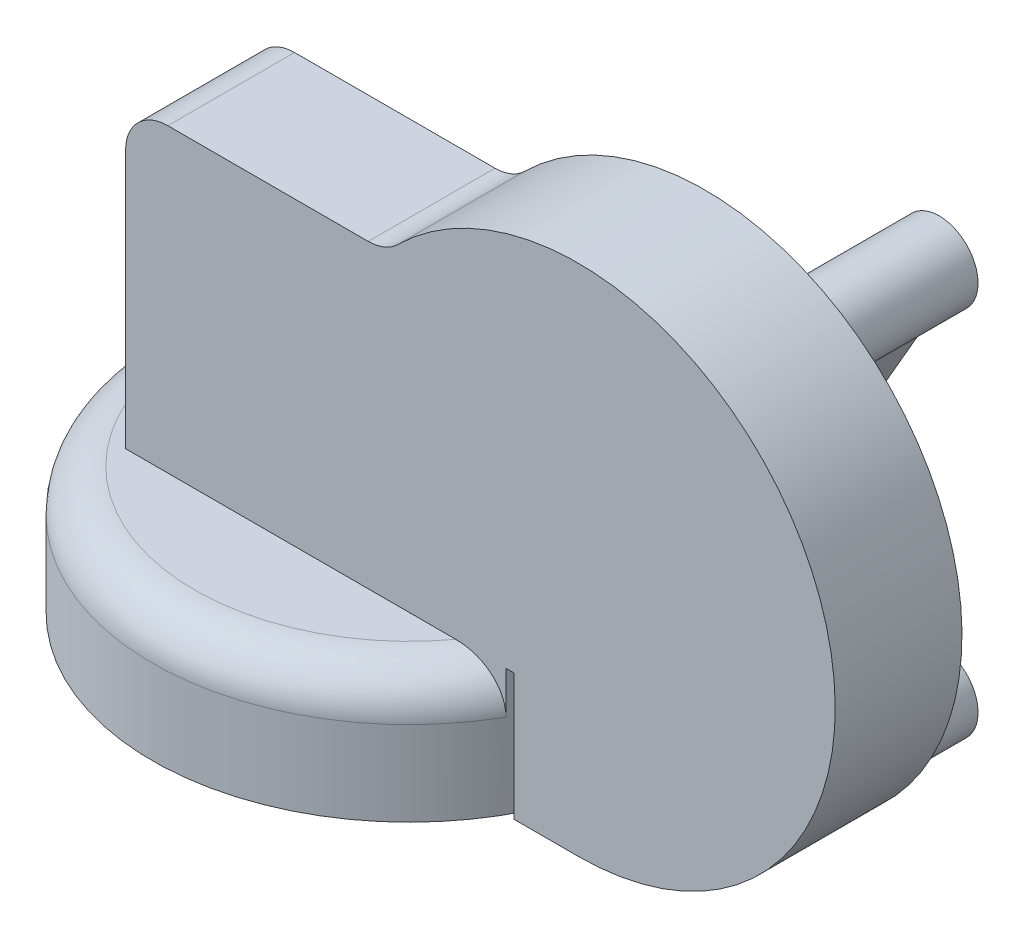
ISO-10303-21;
HEADER;
FILE_DESCRIPTION(('STEP AP214'),'2;1');
FILE_NAME('part.step','',(''),(''),'','','');
FILE_SCHEMA(('AUTOMOTIVE_DESIGN { 1 0 10303 214 1 1 1 1 }'));
ENDSEC;
DATA;
#1=APPLICATION_CONTEXT('core data for automotive mechanical design processes');
#2=APPLICATION_PROTOCOL_DEFINITION('international standard','automotive_design',2000,#1);
#3=PRODUCT_CONTEXT('',#1,'mechanical');
#4=PRODUCT('Part','Part','',(#3));
#5=PRODUCT_RELATED_PRODUCT_CATEGORY('part','',(#4));
#6=PRODUCT_DEFINITION_FORMATION('','',#4);
#7=PRODUCT_DEFINITION_CONTEXT('part definition',#1,'design');
#8=PRODUCT_DEFINITION('design','',#6,#7);
#9=PRODUCT_DEFINITION_SHAPE('','',#8);
#10=(LENGTH_UNIT() NAMED_UNIT(*) SI_UNIT(.MILLI.,.METRE.));
#11=(NAMED_UNIT(*) PLANE_ANGLE_UNIT() SI_UNIT($,.RADIAN.));
#12=(NAMED_UNIT(*) SI_UNIT($,.STERADIAN.) SOLID_ANGLE_UNIT());
#13=UNCERTAINTY_MEASURE_WITH_UNIT(LENGTH_MEASURE(1.E-05),#10,'distance_accuracy_value','');
#14=(GEOMETRIC_REPRESENTATION_CONTEXT(3) GLOBAL_UNCERTAINTY_ASSIGNED_CONTEXT((#13)) GLOBAL_UNIT_ASSIGNED_CONTEXT((#10,
#11,#12)) REPRESENTATION_CONTEXT('',''));
#15=CARTESIAN_POINT('',(0.,0.,0.));
#16=DIRECTION('',(0.,0.,1.));
#17=DIRECTION('',(1.,0.,0.));
#18=AXIS2_PLACEMENT_3D('',#15,#16,#17);
#19=CARTESIAN_POINT('',(35.,30.4,0.));
#20=DIRECTION('',(0.,0.,1.));
#21=DIRECTION('',(1.,0.,0.));
#22=AXIS2_PLACEMENT_3D('',#19,#20,#21);
#23=PLANE('',#22);
#24=DIRECTION('',(0.,-1.,0.));
#25=VECTOR('',#24,1.);
#26=CARTESIAN_POINT('',(-18.5758086309329,50.6001142080126,0.));
#27=LINE('',#26,#25);
#28=CARTESIAN_POINT('',(-18.5758086309329,45.6001142080127,0.));
#29=VERTEX_POINT('',#28);
#30=CARTESIAN_POINT('',(-18.5758086309329,15.,0.));
#31=VERTEX_POINT('',#30);
#32=EDGE_CURVE('E241',#29,#31,#27,.T.);
#33=ORIENTED_EDGE('',*,*,#32,.F.);
#34=CARTESIAN_POINT('',(-13.5758086309329,45.6001142080127,0.));
#35=DIRECTION('',(0.,0.,1.));
#36=DIRECTION('',(1.,0.,0.));
#37=AXIS2_PLACEMENT_3D('',#34,#35,#36);
#38=CIRCLE('',#37,5.);
#39=CARTESIAN_POINT('',(-13.5758086309329,50.6001142080126,0.));
#40=VERTEX_POINT('',#39);
#41=EDGE_CURVE('E269',#29,#40,#38,.F.);
#42=ORIENTED_EDGE('',*,*,#41,.T.);
#43=DIRECTION('',(-1.,0.,0.));
#44=VECTOR('',#43,1.);
#45=CARTESIAN_POINT('',(12.2818269664296,50.6001142080126,0.));
#46=LINE('',#45,#44);
#47=CARTESIAN_POINT('',(10.1380965349972,50.6001142080126,0.));
#48=VERTEX_POINT('',#47);
#49=EDGE_CURVE('E238',#48,#40,#46,.T.);
#50=ORIENTED_EDGE('',*,*,#49,.F.);
#51=CARTESIAN_POINT('',(10.1380965349972,55.6001142080126,0.));
#52=DIRECTION('',(0.,0.,1.));
#53=DIRECTION('',(1.,0.,0.));
#54=AXIS2_PLACEMENT_3D('',#51,#52,#53);
#55=CIRCLE('',#54,5.);
#56=CARTESIAN_POINT('',(13.6496648210145,52.0407760430391,0.));
#57=VERTEX_POINT('',#56);
#58=EDGE_CURVE('E288',#48,#57,#55,.T.);
#59=ORIENTED_EDGE('',*,*,#58,.T.);
#60=CARTESIAN_POINT('',(35.,30.4,0.));
#61=DIRECTION('',(0.,0.,1.));
#62=DIRECTION('',(1.,0.,0.));
#63=AXIS2_PLACEMENT_3D('',#60,#61,#62);
#64=CIRCLE('',#63,30.4);
#65=CARTESIAN_POINT('',(35.,0.,0.));
#66=VERTEX_POINT('',#65);
#67=EDGE_CURVE('E211',#66,#57,#64,.T.);
#68=ORIENTED_EDGE('',*,*,#67,.F.);
#69=DIRECTION('',(1.,0.,0.));
#70=VECTOR('',#69,1.);
#71=CARTESIAN_POINT('',(27.3860251075192,0.,0.));
#72=LINE('',#71,#70);
#73=CARTESIAN_POINT('',(30.4,0.,0.));
#74=VERTEX_POINT('',#73);
#75=EDGE_CURVE('E209',#74,#66,#72,.T.);
#76=ORIENTED_EDGE('',*,*,#75,.F.);
#77=DIRECTION('',(0.,-1.,0.));
#78=VECTOR('',#77,1.);
#79=CARTESIAN_POINT('',(30.4,15.,0.));
#80=LINE('',#79,#78);
#81=CARTESIAN_POINT('',(30.4,10.,0.));
#82=VERTEX_POINT('',#81);
#83=EDGE_CURVE('E256',#74,#82,#80,.F.);
#84=ORIENTED_EDGE('',*,*,#83,.T.);
#85=CARTESIAN_POINT('',(25.4,10.,0.));
#86=DIRECTION('',(0.,0.,1.));
#87=DIRECTION('',(1.,0.,0.));
#88=AXIS2_PLACEMENT_3D('',#85,#86,#87);
#89=CIRCLE('',#88,5.);
#90=CARTESIAN_POINT('',(25.4,15.,0.));
#91=VERTEX_POINT('',#90);
#92=EDGE_CURVE('E11',#82,#91,#89,.T.);
#93=ORIENTED_EDGE('',*,*,#92,.T.);
#94=DIRECTION('',(1.,0.,0.));
#95=VECTOR('',#94,1.);
#96=CARTESIAN_POINT('',(-18.5758086309329,15.,0.));
#97=LINE('',#96,#95);
#98=EDGE_CURVE('E221',#31,#91,#97,.T.);
#99=ORIENTED_EDGE('',*,*,#98,.F.);
#100=EDGE_LOOP('',(#33,#42,#50,#59,#68,#76,#84,#93,#99));
#101=FACE_BOUND('',#100,.T.);
#102=CARTESIAN_POINT('',(47.7000000000001,52.3970452561247,0.));
#103=DIRECTION('',(0.,0.,-1.));
#104=DIRECTION('',(-1.,0.,0.));
#105=AXIS2_PLACEMENT_3D('',#102,#103,#104);
#106=CIRCLE('',#105,4.6);
#107=CARTESIAN_POINT('',(43.7162831425917,50.0970452561247,0.));
#108=VERTEX_POINT('',#107);
#109=CARTESIAN_POINT('',(47.7000000000001,47.7970452561247,0.));
#110=VERTEX_POINT('',#109);
#111=EDGE_CURVE('E208',#108,#110,#106,.T.);
#112=ORIENTED_EDGE('',*,*,#111,.F.);
#113=DIRECTION('',(0.500000000000004,0.866025403784436,0.));
#114=VECTOR('',#113,1.);
#115=CARTESIAN_POINT('',(43.7162831425917,50.0970452561247,0.));
#116=LINE('',#115,#114);
#117=CARTESIAN_POINT('',(35.,35.,0.));
#118=VERTEX_POINT('',#117);
#119=EDGE_CURVE('E205',#118,#108,#116,.T.);
#120=ORIENTED_EDGE('',*,*,#119,.F.);
#121=CARTESIAN_POINT('',(35.,30.4,0.));
#122=DIRECTION('',(0.,0.,-1.));
#123=DIRECTION('',(-1.,0.,0.));
#124=AXIS2_PLACEMENT_3D('',#121,#122,#123);
#125=CIRCLE('',#124,4.6);
#126=CARTESIAN_POINT('',(31.0162831425916,32.7,0.));
#127=VERTEX_POINT('',#126);
#128=EDGE_CURVE('E383',#127,#118,#125,.T.);
#129=ORIENTED_EDGE('',*,*,#128,.F.);
#130=DIRECTION('',(1.,0.,0.));
#131=VECTOR('',#130,1.);
#132=CARTESIAN_POINT('',(13.5837168574084,32.7,0.));
#133=LINE('',#132,#131);
#134=CARTESIAN_POINT('',(13.5837168574084,32.7,0.));
#135=VERTEX_POINT('',#134);
#136=EDGE_CURVE('E441',#135,#127,#133,.T.);
#137=ORIENTED_EDGE('',*,*,#136,.F.);
#138=CARTESIAN_POINT('',(9.6,30.4,0.));
#139=DIRECTION('',(0.,0.,-1.));
#140=DIRECTION('',(-1.,0.,0.));
#141=AXIS2_PLACEMENT_3D('',#138,#139,#140);
#142=CIRCLE('',#141,4.60000000000001);
#143=CARTESIAN_POINT('',(13.5837168574084,28.1,0.));
#144=VERTEX_POINT('',#143);
#145=EDGE_CURVE('E438',#144,#135,#142,.T.);
#146=ORIENTED_EDGE('',*,*,#145,.F.);
#147=DIRECTION('',(-1.,0.,0.));
#148=VECTOR('',#147,1.);
#149=CARTESIAN_POINT('',(31.0162831425916,28.1,0.));
#150=LINE('',#149,#148);
#151=CARTESIAN_POINT('',(31.0162831425916,28.1,0.));
#152=VERTEX_POINT('',#151);
#153=EDGE_CURVE('E435',#152,#144,#150,.T.);
#154=ORIENTED_EDGE('',*,*,#153,.F.);
#155=CARTESIAN_POINT('',(35.,30.4,0.));
#156=DIRECTION('',(0.,0.,-1.));
#157=DIRECTION('',(-1.,0.,0.));
#158=AXIS2_PLACEMENT_3D('',#155,#156,#157);
#159=CIRCLE('',#158,4.6);
#160=CARTESIAN_POINT('',(35.,25.8,0.));
#161=VERTEX_POINT('',#160);
#162=EDGE_CURVE('E432',#161,#152,#159,.T.);
#163=ORIENTED_EDGE('',*,*,#162,.F.);
#164=DIRECTION('',(-0.499999999999991,0.866025403784444,0.));
#165=VECTOR('',#164,1.);
#166=CARTESIAN_POINT('',(35.,25.8,0.));
#167=LINE('',#166,#165);
#168=CARTESIAN_POINT('',(43.7162831425914,10.7029547438752,0.));
#169=VERTEX_POINT('',#168);
#170=EDGE_CURVE('E429',#169,#161,#167,.T.);
#171=ORIENTED_EDGE('',*,*,#170,.F.);
#172=CARTESIAN_POINT('',(47.6999999999998,8.40295474387513,0.));
#173=DIRECTION('',(0.,0.,-1.));
#174=DIRECTION('',(-1.,0.,0.));
#175=AXIS2_PLACEMENT_3D('',#172,#173,#174);
#176=CIRCLE('',#175,4.60000000000001);
#177=CARTESIAN_POINT('',(47.6999999999998,13.0029547438751,0.));
#178=VERTEX_POINT('',#177);
#179=EDGE_CURVE('E423',#178,#169,#176,.T.);
#180=ORIENTED_EDGE('',*,*,#179,.F.);
#181=DIRECTION('',(0.499999999999991,-0.866025403784444,0.));
#182=VECTOR('',#181,1.);
#183=CARTESIAN_POINT('',(38.9837168574084,28.0999999999999,0.));
#184=LINE('',#183,#182);
#185=CARTESIAN_POINT('',(38.9837168574084,28.0999999999999,0.));
#186=VERTEX_POINT('',#185);
#187=EDGE_CURVE('E418',#186,#178,#184,.T.);
#188=ORIENTED_EDGE('',*,*,#187,.F.);
#189=CARTESIAN_POINT('',(35.,30.4,0.));
#190=DIRECTION('',(0.,0.,-1.));
#191=DIRECTION('',(-1.,0.,0.));
#192=AXIS2_PLACEMENT_3D('',#189,#190,#191);
#193=CIRCLE('',#192,4.60000000000001);
#194=CARTESIAN_POINT('',(38.9837168574085,32.7,0.));
#195=VERTEX_POINT('',#194);
#196=EDGE_CURVE('E54',#195,#186,#193,.T.);
#197=ORIENTED_EDGE('',*,*,#196,.F.);
#198=DIRECTION('',(-0.500000000000004,-0.866025403784436,0.));
#199=VECTOR('',#198,1.);
#200=CARTESIAN_POINT('',(47.7000000000001,47.7970452561247,0.));
#201=LINE('',#200,#199);
#202=EDGE_CURVE('E49',#110,#195,#201,.T.);
#203=ORIENTED_EDGE('',*,*,#202,.F.);
#204=EDGE_LOOP('',(#112,#120,#129,#137,#146,#154,#163,#171,#180,#188,#197,#203));
#205=FACE_BOUND('',#204,.T.);
#206=ADVANCED_FACE('F33',(#101,#205),#23,.F.);
#207=CARTESIAN_POINT('',(0.,15.,0.));
#208=DIRECTION('',(0.,-1.,0.));
#209=DIRECTION('',(0.,0.,-1.));
#210=AXIS2_PLACEMENT_3D('',#207,#208,#209);
#211=CYLINDRICAL_SURFACE('',#210,30.4);
#212=CARTESIAN_POINT('',(0.,15.,0.));
#213=DIRECTION('',(0.,1.,0.));
#214=DIRECTION('',(0.,0.,1.));
#215=AXIS2_PLACEMENT_3D('',#212,#213,#214);
#216=CIRCLE('',#215,30.4);
#217=CARTESIAN_POINT('',(26.4416338375676,15.,15.));
#218=VERTEX_POINT('',#217);
#219=CARTESIAN_POINT('',(27.3860251075192,15.,13.1971826088119));
#220=VERTEX_POINT('',#219);
#221=EDGE_CURVE('E262',#218,#220,#216,.T.);
#222=ORIENTED_EDGE('',*,*,#221,.F.);
#223=DIRECTION('',(0.,-1.,0.));
#224=VECTOR('',#223,1.);
#225=CARTESIAN_POINT('',(26.4416338375676,15.,15.));
#226=LINE('',#225,#224);
#227=CARTESIAN_POINT('',(26.4416338375676,10.,15.));
#228=VERTEX_POINT('',#227);
#229=EDGE_CURVE('E285',#218,#228,#226,.T.);
#230=ORIENTED_EDGE('',*,*,#229,.T.);
#231=CARTESIAN_POINT('',(0.,10.,0.));
#232=DIRECTION('',(0.,1.,0.));
#233=DIRECTION('',(0.,0.,1.));
#234=AXIS2_PLACEMENT_3D('',#231,#232,#233);
#235=CIRCLE('',#234,30.4);
#236=EDGE_CURVE('E283',#228,#82,#235,.F.);
#237=ORIENTED_EDGE('',*,*,#236,.T.);
#238=ORIENTED_EDGE('',*,*,#83,.F.);
#239=CARTESIAN_POINT('',(0.,0.,0.));
#240=DIRECTION('',(0.,1.,0.));
#241=DIRECTION('',(0.,0.,1.));
#242=AXIS2_PLACEMENT_3D('',#239,#240,#241);
#243=CIRCLE('',#242,30.4);
#244=CARTESIAN_POINT('',(27.3860251075192,0.,13.1971826088119));
#245=VERTEX_POINT('',#244);
#246=EDGE_CURVE('E261',#74,#245,#243,.T.);
#247=ORIENTED_EDGE('',*,*,#246,.T.);
#248=DIRECTION('',(0.,-1.,0.));
#249=VECTOR('',#248,1.);
#250=CARTESIAN_POINT('',(27.3860251075192,15.,13.1971826088119));
#251=LINE('',#250,#249);
#252=EDGE_CURVE('E259',#220,#245,#251,.T.);
#253=ORIENTED_EDGE('',*,*,#252,.F.);
#254=EDGE_LOOP('',(#222,#230,#237,#238,#247,#253));
#255=FACE_BOUND('',#254,.T.);
#256=ADVANCED_FACE('F306',(#255),#211,.T.);
#257=CARTESIAN_POINT('',(0.,15.,0.));
#258=DIRECTION('',(0.,1.,0.));
#259=DIRECTION('',(0.,0.,1.));
#260=AXIS2_PLACEMENT_3D('',#257,#258,#259);
#261=PLANE('',#260);
#262=ORIENTED_EDGE('',*,*,#98,.T.);
#263=CARTESIAN_POINT('',(0.,15.,0.));
#264=DIRECTION('',(0.,1.,0.));
#265=DIRECTION('',(0.,0.,1.));
#266=AXIS2_PLACEMENT_3D('',#263,#264,#265);
#267=CIRCLE('',#266,25.4);
#268=CARTESIAN_POINT('',(20.4978047605103,15.,15.));
#269=VERTEX_POINT('',#268);
#270=EDGE_CURVE('E280',#91,#269,#267,.T.);
#271=ORIENTED_EDGE('',*,*,#270,.T.);
#272=DIRECTION('',(1.,0.,0.));
#273=VECTOR('',#272,1.);
#274=CARTESIAN_POINT('',(-18.5758086309329,15.,15.));
#275=LINE('',#274,#273);
#276=CARTESIAN_POINT('',(-18.5758086309329,15.,15.));
#277=VERTEX_POINT('',#276);
#278=EDGE_CURVE('E232',#277,#269,#275,.T.);
#279=ORIENTED_EDGE('',*,*,#278,.F.);
#280=DIRECTION('',(0.,0.,-1.));
#281=VECTOR('',#280,1.);
#282=CARTESIAN_POINT('',(-18.5758086309329,15.,15.));
#283=LINE('',#282,#281);
#284=EDGE_CURVE('E247',#277,#31,#283,.T.);
#285=ORIENTED_EDGE('',*,*,#284,.T.);
#286=EDGE_LOOP('',(#262,#271,#279,#285));
#287=FACE_BOUND('',#286,.T.);
#288=ADVANCED_FACE('F328',(#287),#261,.T.);
#289=CARTESIAN_POINT('',(0.,0.,0.));
#290=DIRECTION('',(0.,1.,0.));
#291=DIRECTION('',(0.,0.,1.));
#292=AXIS2_PLACEMENT_3D('',#289,#290,#291);
#293=PLANE('',#292);
#294=ORIENTED_EDGE('',*,*,#246,.F.);
#295=ORIENTED_EDGE('',*,*,#75,.T.);
#296=DIRECTION('',(0.,0.,-1.));
#297=VECTOR('',#296,1.);
#298=CARTESIAN_POINT('',(35.,0.,15.));
#299=LINE('',#298,#297);
#300=CARTESIAN_POINT('',(35.,0.,15.));
#301=VERTEX_POINT('',#300);
#302=EDGE_CURVE('E250',#301,#66,#299,.T.);
#303=ORIENTED_EDGE('',*,*,#302,.F.);
#304=DIRECTION('',(1.,0.,0.));
#305=VECTOR('',#304,1.);
#306=CARTESIAN_POINT('',(27.3860251075192,0.,15.));
#307=LINE('',#306,#305);
#308=CARTESIAN_POINT('',(27.3860251075192,0.,15.));
#309=VERTEX_POINT('',#308);
#310=EDGE_CURVE('E220',#309,#301,#307,.T.);
#311=ORIENTED_EDGE('',*,*,#310,.F.);
#312=DIRECTION('',(0.,0.,-1.));
#313=VECTOR('',#312,1.);
#314=CARTESIAN_POINT('',(27.3860251075192,0.,15.));
#315=LINE('',#314,#313);
#316=EDGE_CURVE('E253',#309,#245,#315,.T.);
#317=ORIENTED_EDGE('',*,*,#316,.T.);
#318=EDGE_LOOP('',(#294,#295,#303,#311,#317));
#319=FACE_BOUND('',#318,.T.);
#320=ADVANCED_FACE('F312',(#319),#293,.F.);
#321=CARTESIAN_POINT('',(-18.5758086309329,15.,15.));
#322=DIRECTION('',(0.,1.,0.));
#323=DIRECTION('',(0.,0.,1.));
#324=AXIS2_PLACEMENT_3D('',#321,#322,#323);
#325=PLANE('',#324);
#326=CARTESIAN_POINT('',(27.3860251075192,15.,15.));
#327=VERTEX_POINT('',#326);
#328=EDGE_CURVE('E231',#218,#327,#275,.T.);
#329=ORIENTED_EDGE('',*,*,#328,.F.);
#330=ORIENTED_EDGE('',*,*,#221,.T.);
#331=DIRECTION('',(0.,0.,-1.));
#332=VECTOR('',#331,1.);
#333=CARTESIAN_POINT('',(27.3860251075192,15.,15.));
#334=LINE('',#333,#332);
#335=EDGE_CURVE('E234',#327,#220,#334,.T.);
#336=ORIENTED_EDGE('',*,*,#335,.F.);
#337=EDGE_LOOP('',(#329,#330,#336));
#338=FACE_BOUND('',#337,.T.);
#339=ADVANCED_FACE('F308',(#338),#325,.F.);
#340=CARTESIAN_POINT('',(27.3860251075192,15.,15.));
#341=DIRECTION('',(1.,0.,0.));
#342=DIRECTION('',(0.,0.,-1.));
#343=AXIS2_PLACEMENT_3D('',#340,#341,#342);
#344=PLANE('',#343);
#345=ORIENTED_EDGE('',*,*,#335,.T.);
#346=ORIENTED_EDGE('',*,*,#252,.T.);
#347=ORIENTED_EDGE('',*,*,#316,.F.);
#348=DIRECTION('',(0.,-1.,0.));
#349=VECTOR('',#348,1.);
#350=CARTESIAN_POINT('',(27.3860251075192,15.,15.));
#351=LINE('',#350,#349);
#352=EDGE_CURVE('E217',#327,#309,#351,.T.);
#353=ORIENTED_EDGE('',*,*,#352,.F.);
#354=EDGE_LOOP('',(#345,#346,#347,#353));
#355=FACE_BOUND('',#354,.T.);
#356=ADVANCED_FACE('F311',(#355),#344,.F.);
#357=CARTESIAN_POINT('',(35.,30.4,15.));
#358=DIRECTION('',(0.,0.,-1.));
#359=DIRECTION('',(-1.,0.,0.));
#360=AXIS2_PLACEMENT_3D('',#357,#358,#359);
#361=CYLINDRICAL_SURFACE('',#360,30.4);
#362=ORIENTED_EDGE('',*,*,#67,.T.);
#363=DIRECTION('',(0.,0.,-1.));
#364=VECTOR('',#363,1.);
#365=CARTESIAN_POINT('',(13.6496648210145,52.0407760430391,15.));
#366=LINE('',#365,#364);
#367=CARTESIAN_POINT('',(13.6496648210145,52.0407760430391,15.));
#368=VERTEX_POINT('',#367);
#369=EDGE_CURVE('E278',#57,#368,#366,.F.);
#370=ORIENTED_EDGE('',*,*,#369,.T.);
#371=CARTESIAN_POINT('',(35.,30.4,15.));
#372=DIRECTION('',(0.,0.,1.));
#373=DIRECTION('',(1.,0.,0.));
#374=AXIS2_PLACEMENT_3D('',#371,#372,#373);
#375=CIRCLE('',#374,30.4);
#376=EDGE_CURVE('E223',#301,#368,#375,.T.);
#377=ORIENTED_EDGE('',*,*,#376,.F.);
#378=ORIENTED_EDGE('',*,*,#302,.T.);
#379=EDGE_LOOP('',(#362,#370,#377,#378));
#380=FACE_BOUND('',#379,.T.);
#381=ADVANCED_FACE('F320',(#380),#361,.T.);
#382=CARTESIAN_POINT('',(12.2818269664296,50.6001142080126,15.));
#383=DIRECTION('',(0.,-1.,0.));
#384=DIRECTION('',(0.,0.,-1.));
#385=AXIS2_PLACEMENT_3D('',#382,#383,#384);
#386=PLANE('',#385);
#387=ORIENTED_EDGE('',*,*,#49,.T.);
#388=DIRECTION('',(0.,0.,-1.));
#389=VECTOR('',#388,1.);
#390=CARTESIAN_POINT('',(-13.5758086309329,50.6001142080126,15.));
#391=LINE('',#390,#389);
#392=CARTESIAN_POINT('',(-13.5758086309329,50.6001142080126,15.));
#393=VERTEX_POINT('',#392);
#394=EDGE_CURVE('E274',#40,#393,#391,.F.);
#395=ORIENTED_EDGE('',*,*,#394,.T.);
#396=DIRECTION('',(-1.,0.,0.));
#397=VECTOR('',#396,1.);
#398=CARTESIAN_POINT('',(12.2818269664296,50.6001142080126,15.));
#399=LINE('',#398,#397);
#400=CARTESIAN_POINT('',(10.1380965349972,50.6001142080126,15.));
#401=VERTEX_POINT('',#400);
#402=EDGE_CURVE('E226',#401,#393,#399,.T.);
#403=ORIENTED_EDGE('',*,*,#402,.F.);
#404=DIRECTION('',(0.,0.,1.));
#405=VECTOR('',#404,1.);
#406=CARTESIAN_POINT('',(10.1380965349972,50.6001142080126,0.));
#407=LINE('',#406,#405);
#408=EDGE_CURVE('E271',#401,#48,#407,.F.);
#409=ORIENTED_EDGE('',*,*,#408,.T.);
#410=EDGE_LOOP('',(#387,#395,#403,#409));
#411=FACE_BOUND('',#410,.T.);
#412=ADVANCED_FACE('F316',(#411),#386,.F.);
#413=CARTESIAN_POINT('',(-18.5758086309329,50.6001142080126,15.));
#414=DIRECTION('',(1.,0.,0.));
#415=DIRECTION('',(0.,0.,-1.));
#416=AXIS2_PLACEMENT_3D('',#413,#414,#415);
#417=PLANE('',#416);
#418=DIRECTION('',(0.,-1.,0.));
#419=VECTOR('',#418,1.);
#420=CARTESIAN_POINT('',(-18.5758086309329,50.6001142080126,15.));
#421=LINE('',#420,#419);
#422=CARTESIAN_POINT('',(-18.5758086309329,45.6001142080127,15.));
#423=VERTEX_POINT('',#422);
#424=EDGE_CURVE('E229',#423,#277,#421,.T.);
#425=ORIENTED_EDGE('',*,*,#424,.F.);
#426=DIRECTION('',(0.,0.,-1.));
#427=VECTOR('',#426,1.);
#428=CARTESIAN_POINT('',(-18.5758086309329,45.6001142080127,15.));
#429=LINE('',#428,#427);
#430=EDGE_CURVE('E264',#423,#29,#429,.T.);
#431=ORIENTED_EDGE('',*,*,#430,.T.);
#432=ORIENTED_EDGE('',*,*,#32,.T.);
#433=ORIENTED_EDGE('',*,*,#284,.F.);
#434=EDGE_LOOP('',(#425,#431,#432,#433));
#435=FACE_BOUND('',#434,.T.);
#436=ADVANCED_FACE('F301',(#435),#417,.F.);
#437=CARTESIAN_POINT('',(35.,30.4,15.));
#438=DIRECTION('',(0.,0.,1.));
#439=DIRECTION('',(1.,0.,0.));
#440=AXIS2_PLACEMENT_3D('',#437,#438,#439);
#441=PLANE('',#440);
#442=ORIENTED_EDGE('',*,*,#402,.T.);
#443=CARTESIAN_POINT('',(-13.5758086309329,45.6001142080127,15.));
#444=DIRECTION('',(0.,0.,1.));
#445=DIRECTION('',(1.,0.,0.));
#446=AXIS2_PLACEMENT_3D('',#443,#444,#445);
#447=CIRCLE('',#446,5.);
#448=EDGE_CURVE('E276',#393,#423,#447,.T.);
#449=ORIENTED_EDGE('',*,*,#448,.T.);
#450=ORIENTED_EDGE('',*,*,#424,.T.);
#451=ORIENTED_EDGE('',*,*,#278,.T.);
#452=CARTESIAN_POINT('',(20.4978047605103,15.,15.));
#453=CARTESIAN_POINT('',(20.7097904623979,15.0000014386978,15.));
#454=CARTESIAN_POINT('',(20.9218438213524,14.9912190269975,15.));
#455=CARTESIAN_POINT('',(21.3446905920645,14.955483564442,15.));
#456=CARTESIAN_POINT('',(21.5554819288154,14.9285061220144,15.));
#457=CARTESIAN_POINT('',(21.9748494708244,14.855597421046,15.));
#458=CARTESIAN_POINT('',(22.1834098906362,14.809574504078,15.));
#459=CARTESIAN_POINT('',(22.5951711087041,14.6980592675721,15.));
#460=CARTESIAN_POINT('',(22.7983751949004,14.632579209636,15.));
#461=CARTESIAN_POINT('',(23.1499558838713,14.4996457517246,15.));
#462=CARTESIAN_POINT('',(23.2999099921508,14.4363402404806,15.));
#463=CARTESIAN_POINT('',(23.5943340737744,14.2980739147228,15.));
#464=CARTESIAN_POINT('',(23.7388051769907,14.2231155179001,15.));
#465=CARTESIAN_POINT('',(24.0208594415149,14.0616573631566,15.));
#466=CARTESIAN_POINT('',(24.1584531363109,13.9751760482204,15.));
#467=CARTESIAN_POINT('',(24.4256444793825,13.7907430198083,15.));
#468=CARTESIAN_POINT('',(24.5552461267807,13.692797115362,15.));
#469=CARTESIAN_POINT('',(24.8062457392616,13.4847729047735,15.));
#470=CARTESIAN_POINT('',(24.927562931493,13.3745968681466,15.));
#471=CARTESIAN_POINT('',(25.1592286576509,13.1433447459512,15.));
#472=CARTESIAN_POINT('',(25.2695826820048,13.0222741749283,15.));
#473=CARTESIAN_POINT('',(25.4779537531181,12.7698299802209,15.));
#474=CARTESIAN_POINT('',(25.5759651489744,12.6384516816388,15.));
#475=CARTESIAN_POINT('',(25.758112932172,12.3664133765622,15.));
#476=CARTESIAN_POINT('',(25.8422524211274,12.2257554547694,15.));
#477=CARTESIAN_POINT('',(25.9850456438243,11.9557676535123,15.));
#478=CARTESIAN_POINT('',(26.0456032718685,11.8274419992874,15.));
#479=CARTESIAN_POINT('',(26.1544917209337,11.5657123351284,15.));
#480=CARTESIAN_POINT('',(26.2028246818906,11.4323092187175,15.));
#481=CARTESIAN_POINT('',(26.2865038675378,11.1618091715952,15.));
#482=CARTESIAN_POINT('',(26.3218781549707,11.0247209211448,15.));
#483=CARTESIAN_POINT('',(26.3792545956085,10.7478414845835,15.));
#484=CARTESIAN_POINT('',(26.4012656376122,10.6080521591413,15.));
#485=CARTESIAN_POINT('',(26.4248337147886,10.3898727771064,15.));
#486=CARTESIAN_POINT('',(26.4311356766282,10.3119675861289,15.));
#487=CARTESIAN_POINT('',(26.4395334062178,10.1560455812641,15.));
#488=CARTESIAN_POINT('',(26.4416353330813,10.0780290989642,15.));
#489=CARTESIAN_POINT('',(26.4416338375677,10.,15.));
#490=B_SPLINE_CURVE_WITH_KNOTS('',3,(#452,#453,#454,#455,#456,#457,#458,#459,#460,#461,#462,
#463,#464,#465,#466,#467,#468,#469,#470,#471,#472,#473,#474,#475,#476,#477,#478,#479,#480,#481,
#482,#483,#484,#485,#486,#487,#488,#489),.UNSPECIFIED.,.F.,.F.,(4,2,2,2,2,2,2,2,2,2,2,2,2,2,2,2,
2,2,4),(0.,0.635878691704848,1.27261151721903,1.91244499871116,2.55187611868417,
3.03971834467659,3.52745948999877,4.01442915507827,4.5011531354334,4.99209258376459,
5.482784913635,5.97370108973617,6.46450735278779,6.889610224522,7.31463863014492,
7.73874109410906,8.16256114886779,8.39693914960224,8.63097319529239),.UNSPECIFIED.);
#491=EDGE_CURVE('E42',#269,#228,#490,.T.);
#492=ORIENTED_EDGE('',*,*,#491,.T.);
#493=ORIENTED_EDGE('',*,*,#229,.F.);
#494=ORIENTED_EDGE('',*,*,#328,.T.);
#495=ORIENTED_EDGE('',*,*,#352,.T.);
#496=ORIENTED_EDGE('',*,*,#310,.T.);
#497=ORIENTED_EDGE('',*,*,#376,.T.);
#498=CARTESIAN_POINT('',(10.1380965349972,55.6001142080126,15.));
#499=DIRECTION('',(0.,0.,1.));
#500=DIRECTION('',(1.,0.,0.));
#501=AXIS2_PLACEMENT_3D('',#498,#499,#500);
#502=CIRCLE('',#501,5.);
#503=EDGE_CURVE('E290',#368,#401,#502,.F.);
#504=ORIENTED_EDGE('',*,*,#503,.T.);
#505=EDGE_LOOP('',(#442,#449,#450,#451,#492,#493,#494,#495,#496,#497,#504));
#506=FACE_BOUND('',#505,.T.);
#507=ADVANCED_FACE('F295',(#506),#441,.T.);
#508=CARTESIAN_POINT('',(-13.5758086309329,45.6001142080127,15.));
#509=DIRECTION('',(0.,0.,-1.));
#510=DIRECTION('',(-1.,0.,0.));
#511=AXIS2_PLACEMENT_3D('',#508,#509,#510);
#512=CYLINDRICAL_SURFACE('',#511,5.);
#513=ORIENTED_EDGE('',*,*,#448,.F.);
#514=ORIENTED_EDGE('',*,*,#394,.F.);
#515=ORIENTED_EDGE('',*,*,#41,.F.);
#516=ORIENTED_EDGE('',*,*,#430,.F.);
#517=EDGE_LOOP('',(#513,#514,#515,#516));
#518=FACE_BOUND('',#517,.T.);
#519=ADVANCED_FACE('F300',(#518),#512,.T.);
#520=CARTESIAN_POINT('',(10.1380965349972,55.6001142080126,15.));
#521=DIRECTION('',(0.,0.,-1.));
#522=DIRECTION('',(-1.,0.,0.));
#523=AXIS2_PLACEMENT_3D('',#520,#521,#522);
#524=CYLINDRICAL_SURFACE('',#523,5.);
#525=ORIENTED_EDGE('',*,*,#503,.F.);
#526=ORIENTED_EDGE('',*,*,#369,.F.);
#527=ORIENTED_EDGE('',*,*,#58,.F.);
#528=ORIENTED_EDGE('',*,*,#408,.F.);
#529=EDGE_LOOP('',(#525,#526,#527,#528));
#530=FACE_BOUND('',#529,.T.);
#531=ADVANCED_FACE('F339',(#530),#524,.F.);
#532=CARTESIAN_POINT('',(0.,10.,0.));
#533=DIRECTION('',(0.,1.,0.));
#534=DIRECTION('',(0.,0.,1.));
#535=AXIS2_PLACEMENT_3D('',#532,#533,#534);
#536=TOROIDAL_SURFACE('',#535,25.4,5.);
#537=ORIENTED_EDGE('',*,*,#92,.F.);
#538=ORIENTED_EDGE('',*,*,#236,.F.);
#539=ORIENTED_EDGE('',*,*,#491,.F.);
#540=ORIENTED_EDGE('',*,*,#270,.F.);
#541=EDGE_LOOP('',(#537,#538,#539,#540));
#542=FACE_BOUND('',#541,.T.);
#543=ADVANCED_FACE('F35',(#542),#536,.T.);
#544=CARTESIAN_POINT('',(47.7000000000001,52.3970452561247,-15.));
#545=DIRECTION('',(0.,0.,1.));
#546=DIRECTION('',(1.,0.,0.));
#547=AXIS2_PLACEMENT_3D('',#544,#545,#546);
#548=CYLINDRICAL_SURFACE('',#547,4.6);
#549=ORIENTED_EDGE('',*,*,#111,.T.);
#550=DIRECTION('',(0.,0.,1.));
#551=VECTOR('',#550,1.);
#552=CARTESIAN_POINT('',(47.7000000000001,47.7970452561247,-15.));
#553=LINE('',#552,#551);
#554=CARTESIAN_POINT('',(47.7000000000001,47.7970452561247,-15.));
#555=VERTEX_POINT('',#554);
#556=EDGE_CURVE('E189',#555,#110,#553,.T.);
#557=ORIENTED_EDGE('',*,*,#556,.F.);
#558=CARTESIAN_POINT('',(47.7000000000001,52.3970452561247,-15.));
#559=DIRECTION('',(0.,0.,-1.));
#560=DIRECTION('',(-1.,0.,0.));
#561=AXIS2_PLACEMENT_3D('',#558,#559,#560);
#562=CIRCLE('',#561,4.6);
#563=CARTESIAN_POINT('',(43.7162831425917,50.0970452561247,-15.));
#564=VERTEX_POINT('',#563);
#565=EDGE_CURVE('E196',#564,#555,#562,.T.);
#566=ORIENTED_EDGE('',*,*,#565,.F.);
#567=DIRECTION('',(0.,0.,1.));
#568=VECTOR('',#567,1.);
#569=CARTESIAN_POINT('',(43.7162831425917,50.0970452561247,-15.));
#570=LINE('',#569,#568);
#571=EDGE_CURVE('E380',#564,#108,#570,.T.);
#572=ORIENTED_EDGE('',*,*,#571,.T.);
#573=EDGE_LOOP('',(#549,#557,#566,#572));
#574=FACE_BOUND('',#573,.T.);
#575=ADVANCED_FACE('F207',(#574),#548,.T.);
#576=CARTESIAN_POINT('',(47.7000000000001,47.7970452561247,-15.));
#577=DIRECTION('',(-0.866025403784436,0.500000000000004,0.));
#578=DIRECTION('',(-0.500000000000004,-0.866025403784436,0.));
#579=AXIS2_PLACEMENT_3D('',#576,#577,#578);
#580=PLANE('',#579);
#581=ORIENTED_EDGE('',*,*,#202,.T.);
#582=DIRECTION('',(0.,0.,1.));
#583=VECTOR('',#582,1.);
#584=CARTESIAN_POINT('',(38.9837168574085,32.7,-15.));
#585=LINE('',#584,#583);
#586=CARTESIAN_POINT('',(38.9837168574085,32.7,-15.));
#587=VERTEX_POINT('',#586);
#588=EDGE_CURVE('E192',#587,#195,#585,.T.);
#589=ORIENTED_EDGE('',*,*,#588,.F.);
#590=DIRECTION('',(-0.500000000000004,-0.866025403784436,0.));
#591=VECTOR('',#590,1.);
#592=CARTESIAN_POINT('',(47.7000000000001,47.7970452561247,-15.));
#593=LINE('',#592,#591);
#594=EDGE_CURVE('E185',#555,#587,#593,.T.);
#595=ORIENTED_EDGE('',*,*,#594,.F.);
#596=ORIENTED_EDGE('',*,*,#556,.T.);
#597=EDGE_LOOP('',(#581,#589,#595,#596));
#598=FACE_BOUND('',#597,.T.);
#599=ADVANCED_FACE('F187',(#598),#580,.F.);
#600=CARTESIAN_POINT('',(35.,30.4,-15.));
#601=DIRECTION('',(0.,0.,1.));
#602=DIRECTION('',(1.,0.,0.));
#603=AXIS2_PLACEMENT_3D('',#600,#601,#602);
#604=CYLINDRICAL_SURFACE('',#603,4.60000000000001);
#605=ORIENTED_EDGE('',*,*,#196,.T.);
#606=DIRECTION('',(0.,0.,1.));
#607=VECTOR('',#606,1.);
#608=CARTESIAN_POINT('',(38.9837168574084,28.0999999999999,-15.));
#609=LINE('',#608,#607);
#610=CARTESIAN_POINT('',(38.9837168574084,28.0999999999999,-15.));
#611=VERTEX_POINT('',#610);
#612=EDGE_CURVE('E213',#611,#186,#609,.T.);
#613=ORIENTED_EDGE('',*,*,#612,.F.);
#614=CARTESIAN_POINT('',(35.,30.4,-15.));
#615=DIRECTION('',(0.,0.,-1.));
#616=DIRECTION('',(-1.,0.,0.));
#617=AXIS2_PLACEMENT_3D('',#614,#615,#616);
#618=CIRCLE('',#617,4.60000000000001);
#619=EDGE_CURVE('E195',#587,#611,#618,.T.);
#620=ORIENTED_EDGE('',*,*,#619,.F.);
#621=ORIENTED_EDGE('',*,*,#588,.T.);
#622=EDGE_LOOP('',(#605,#613,#620,#621));
#623=FACE_BOUND('',#622,.T.);
#624=ADVANCED_FACE('F421',(#623),#604,.T.);
#625=CARTESIAN_POINT('',(38.9837168574084,28.0999999999999,-15.));
#626=DIRECTION('',(-0.866025403784444,-0.499999999999991,0.));
#627=DIRECTION('',(0.499999999999991,-0.866025403784444,0.));
#628=AXIS2_PLACEMENT_3D('',#625,#626,#627);
#629=PLANE('',#628);
#630=ORIENTED_EDGE('',*,*,#187,.T.);
#631=DIRECTION('',(0.,0.,1.));
#632=VECTOR('',#631,1.);
#633=CARTESIAN_POINT('',(47.6999999999998,13.0029547438751,-15.));
#634=LINE('',#633,#632);
#635=CARTESIAN_POINT('',(47.6999999999998,13.0029547438751,-15.));
#636=VERTEX_POINT('',#635);
#637=EDGE_CURVE('E409',#636,#178,#634,.T.);
#638=ORIENTED_EDGE('',*,*,#637,.F.);
#639=DIRECTION('',(0.499999999999991,-0.866025403784444,0.));
#640=VECTOR('',#639,1.);
#641=CARTESIAN_POINT('',(38.9837168574084,28.0999999999999,-15.));
#642=LINE('',#641,#640);
#643=EDGE_CURVE('E419',#611,#636,#642,.T.);
#644=ORIENTED_EDGE('',*,*,#643,.F.);
#645=ORIENTED_EDGE('',*,*,#612,.T.);
#646=EDGE_LOOP('',(#630,#638,#644,#645));
#647=FACE_BOUND('',#646,.T.);
#648=ADVANCED_FACE('F416',(#647),#629,.F.);
#649=CARTESIAN_POINT('',(47.6999999999998,8.40295474387513,-15.));
#650=DIRECTION('',(0.,0.,1.));
#651=DIRECTION('',(1.,0.,0.));
#652=AXIS2_PLACEMENT_3D('',#649,#650,#651);
#653=CYLINDRICAL_SURFACE('',#652,4.60000000000001);
#654=ORIENTED_EDGE('',*,*,#179,.T.);
#655=DIRECTION('',(0.,0.,1.));
#656=VECTOR('',#655,1.);
#657=CARTESIAN_POINT('',(43.7162831425914,10.7029547438752,-15.));
#658=LINE('',#657,#656);
#659=CARTESIAN_POINT('',(43.7162831425914,10.7029547438752,-15.));
#660=VERTEX_POINT('',#659);
#661=EDGE_CURVE('E406',#660,#169,#658,.T.);
#662=ORIENTED_EDGE('',*,*,#661,.F.);
#663=CARTESIAN_POINT('',(47.6999999999998,8.40295474387513,-15.));
#664=DIRECTION('',(0.,0.,-1.));
#665=DIRECTION('',(-1.,0.,0.));
#666=AXIS2_PLACEMENT_3D('',#663,#664,#665);
#667=CIRCLE('',#666,4.60000000000001);
#668=EDGE_CURVE('E475',#636,#660,#667,.T.);
#669=ORIENTED_EDGE('',*,*,#668,.F.);
#670=ORIENTED_EDGE('',*,*,#637,.T.);
#671=EDGE_LOOP('',(#654,#662,#669,#670));
#672=FACE_BOUND('',#671,.T.);
#673=ADVANCED_FACE('F474',(#672),#653,.T.);
#674=CARTESIAN_POINT('',(35.,25.8,-15.));
#675=DIRECTION('',(0.866025403784444,0.499999999999991,0.));
#676=DIRECTION('',(-0.499999999999991,0.866025403784444,0.));
#677=AXIS2_PLACEMENT_3D('',#674,#675,#676);
#678=PLANE('',#677);
#679=ORIENTED_EDGE('',*,*,#170,.T.);
#680=DIRECTION('',(0.,0.,1.));
#681=VECTOR('',#680,1.);
#682=CARTESIAN_POINT('',(35.,25.8,-15.));
#683=LINE('',#682,#681);
#684=CARTESIAN_POINT('',(35.,25.8,-15.));
#685=VERTEX_POINT('',#684);
#686=EDGE_CURVE('E403',#685,#161,#683,.T.);
#687=ORIENTED_EDGE('',*,*,#686,.F.);
#688=DIRECTION('',(-0.499999999999991,0.866025403784444,0.));
#689=VECTOR('',#688,1.);
#690=CARTESIAN_POINT('',(35.,25.8,-15.));
#691=LINE('',#690,#689);
#692=EDGE_CURVE('E471',#660,#685,#691,.T.);
#693=ORIENTED_EDGE('',*,*,#692,.F.);
#694=ORIENTED_EDGE('',*,*,#661,.T.);
#695=EDGE_LOOP('',(#679,#687,#693,#694));
#696=FACE_BOUND('',#695,.T.);
#697=ADVANCED_FACE('F468',(#696),#678,.F.);
#698=CARTESIAN_POINT('',(35.,30.4,-15.));
#699=DIRECTION('',(0.,0.,1.));
#700=DIRECTION('',(1.,0.,0.));
#701=AXIS2_PLACEMENT_3D('',#698,#699,#700);
#702=CYLINDRICAL_SURFACE('',#701,4.6);
#703=ORIENTED_EDGE('',*,*,#162,.T.);
#704=DIRECTION('',(0.,0.,1.));
#705=VECTOR('',#704,1.);
#706=CARTESIAN_POINT('',(31.0162831425916,28.1,-15.));
#707=LINE('',#706,#705);
#708=CARTESIAN_POINT('',(31.0162831425916,28.1,-15.));
#709=VERTEX_POINT('',#708);
#710=EDGE_CURVE('E400',#709,#152,#707,.T.);
#711=ORIENTED_EDGE('',*,*,#710,.F.);
#712=CARTESIAN_POINT('',(35.,30.4,-15.));
#713=DIRECTION('',(0.,0.,-1.));
#714=DIRECTION('',(-1.,0.,0.));
#715=AXIS2_PLACEMENT_3D('',#712,#713,#714);
#716=CIRCLE('',#715,4.6);
#717=EDGE_CURVE('E465',#685,#709,#716,.T.);
#718=ORIENTED_EDGE('',*,*,#717,.F.);
#719=ORIENTED_EDGE('',*,*,#686,.T.);
#720=EDGE_LOOP('',(#703,#711,#718,#719));
#721=FACE_BOUND('',#720,.T.);
#722=ADVANCED_FACE('F464',(#721),#702,.T.);
#723=CARTESIAN_POINT('',(31.0162831425916,28.1,-15.));
#724=DIRECTION('',(0.,1.,0.));
#725=DIRECTION('',(-1.,0.,0.));
#726=AXIS2_PLACEMENT_3D('',#723,#724,#725);
#727=PLANE('',#726);
#728=ORIENTED_EDGE('',*,*,#153,.T.);
#729=DIRECTION('',(0.,0.,1.));
#730=VECTOR('',#729,1.);
#731=CARTESIAN_POINT('',(13.5837168574084,28.1,-15.));
#732=LINE('',#731,#730);
#733=CARTESIAN_POINT('',(13.5837168574084,28.1,-15.));
#734=VERTEX_POINT('',#733);
#735=EDGE_CURVE('E397',#734,#144,#732,.T.);
#736=ORIENTED_EDGE('',*,*,#735,.F.);
#737=DIRECTION('',(-1.,0.,0.));
#738=VECTOR('',#737,1.);
#739=CARTESIAN_POINT('',(31.0162831425916,28.1,-15.));
#740=LINE('',#739,#738);
#741=EDGE_CURVE('E461',#709,#734,#740,.T.);
#742=ORIENTED_EDGE('',*,*,#741,.F.);
#743=ORIENTED_EDGE('',*,*,#710,.T.);
#744=EDGE_LOOP('',(#728,#736,#742,#743));
#745=FACE_BOUND('',#744,.T.);
#746=ADVANCED_FACE('F458',(#745),#727,.F.);
#747=CARTESIAN_POINT('',(9.6,30.4,-15.));
#748=DIRECTION('',(0.,0.,1.));
#749=DIRECTION('',(1.,0.,0.));
#750=AXIS2_PLACEMENT_3D('',#747,#748,#749);
#751=CYLINDRICAL_SURFACE('',#750,4.60000000000001);
#752=ORIENTED_EDGE('',*,*,#145,.T.);
#753=DIRECTION('',(0.,0.,1.));
#754=VECTOR('',#753,1.);
#755=CARTESIAN_POINT('',(13.5837168574084,32.7,-15.));
#756=LINE('',#755,#754);
#757=CARTESIAN_POINT('',(13.5837168574084,32.7,-15.));
#758=VERTEX_POINT('',#757);
#759=EDGE_CURVE('E394',#758,#135,#756,.T.);
#760=ORIENTED_EDGE('',*,*,#759,.F.);
#761=CARTESIAN_POINT('',(9.6,30.4,-15.));
#762=DIRECTION('',(0.,0.,-1.));
#763=DIRECTION('',(-1.,0.,0.));
#764=AXIS2_PLACEMENT_3D('',#761,#762,#763);
#765=CIRCLE('',#764,4.60000000000001);
#766=EDGE_CURVE('E455',#734,#758,#765,.T.);
#767=ORIENTED_EDGE('',*,*,#766,.F.);
#768=ORIENTED_EDGE('',*,*,#735,.T.);
#769=EDGE_LOOP('',(#752,#760,#767,#768));
#770=FACE_BOUND('',#769,.T.);
#771=ADVANCED_FACE('F454',(#770),#751,.T.);
#772=CARTESIAN_POINT('',(13.5837168574084,32.7,-15.));
#773=DIRECTION('',(0.,-1.,0.));
#774=DIRECTION('',(1.,0.,0.));
#775=AXIS2_PLACEMENT_3D('',#772,#773,#774);
#776=PLANE('',#775);
#777=ORIENTED_EDGE('',*,*,#136,.T.);
#778=DIRECTION('',(0.,0.,1.));
#779=VECTOR('',#778,1.);
#780=CARTESIAN_POINT('',(31.0162831425916,32.7,-15.));
#781=LINE('',#780,#779);
#782=CARTESIAN_POINT('',(31.0162831425916,32.7,-15.));
#783=VERTEX_POINT('',#782);
#784=EDGE_CURVE('E386',#783,#127,#781,.T.);
#785=ORIENTED_EDGE('',*,*,#784,.F.);
#786=DIRECTION('',(1.,0.,0.));
#787=VECTOR('',#786,1.);
#788=CARTESIAN_POINT('',(13.5837168574084,32.7,-15.));
#789=LINE('',#788,#787);
#790=EDGE_CURVE('E451',#758,#783,#789,.T.);
#791=ORIENTED_EDGE('',*,*,#790,.F.);
#792=ORIENTED_EDGE('',*,*,#759,.T.);
#793=EDGE_LOOP('',(#777,#785,#791,#792));
#794=FACE_BOUND('',#793,.T.);
#795=ADVANCED_FACE('F448',(#794),#776,.F.);
#796=CARTESIAN_POINT('',(35.,30.4,-15.));
#797=DIRECTION('',(0.,0.,1.));
#798=DIRECTION('',(1.,0.,0.));
#799=AXIS2_PLACEMENT_3D('',#796,#797,#798);
#800=CYLINDRICAL_SURFACE('',#799,4.6);
#801=ORIENTED_EDGE('',*,*,#128,.T.);
#802=DIRECTION('',(0.,0.,1.));
#803=VECTOR('',#802,1.);
#804=CARTESIAN_POINT('',(35.,35.,-15.));
#805=LINE('',#804,#803);
#806=CARTESIAN_POINT('',(35.,35.,-15.));
#807=VERTEX_POINT('',#806);
#808=EDGE_CURVE('E382',#807,#118,#805,.T.);
#809=ORIENTED_EDGE('',*,*,#808,.F.);
#810=CARTESIAN_POINT('',(35.,30.4,-15.));
#811=DIRECTION('',(0.,0.,-1.));
#812=DIRECTION('',(-1.,0.,0.));
#813=AXIS2_PLACEMENT_3D('',#810,#811,#812);
#814=CIRCLE('',#813,4.6);
#815=EDGE_CURVE('E388',#783,#807,#814,.T.);
#816=ORIENTED_EDGE('',*,*,#815,.F.);
#817=ORIENTED_EDGE('',*,*,#784,.T.);
#818=EDGE_LOOP('',(#801,#809,#816,#817));
#819=FACE_BOUND('',#818,.T.);
#820=ADVANCED_FACE('F444',(#819),#800,.T.);
#821=CARTESIAN_POINT('',(43.7162831425917,50.0970452561247,-15.));
#822=DIRECTION('',(0.866025403784436,-0.500000000000004,0.));
#823=DIRECTION('',(0.500000000000004,0.866025403784436,0.));
#824=AXIS2_PLACEMENT_3D('',#821,#822,#823);
#825=PLANE('',#824);
#826=ORIENTED_EDGE('',*,*,#119,.T.);
#827=ORIENTED_EDGE('',*,*,#571,.F.);
#828=DIRECTION('',(0.500000000000004,0.866025403784436,0.));
#829=VECTOR('',#828,1.);
#830=CARTESIAN_POINT('',(43.7162831425917,50.0970452561247,-15.));
#831=LINE('',#830,#829);
#832=EDGE_CURVE('E201',#807,#564,#831,.T.);
#833=ORIENTED_EDGE('',*,*,#832,.F.);
#834=ORIENTED_EDGE('',*,*,#808,.T.);
#835=EDGE_LOOP('',(#826,#827,#833,#834));
#836=FACE_BOUND('',#835,.T.);
#837=ADVANCED_FACE('F379',(#836),#825,.F.);
#838=CARTESIAN_POINT('',(47.7000000000001,52.3970452561247,-15.));
#839=DIRECTION('',(0.,0.,-1.));
#840=DIRECTION('',(-1.,0.,0.));
#841=AXIS2_PLACEMENT_3D('',#838,#839,#840);
#842=PLANE('',#841);
#843=ORIENTED_EDGE('',*,*,#565,.T.);
#844=ORIENTED_EDGE('',*,*,#594,.T.);
#845=ORIENTED_EDGE('',*,*,#619,.T.);
#846=ORIENTED_EDGE('',*,*,#643,.T.);
#847=ORIENTED_EDGE('',*,*,#668,.T.);
#848=ORIENTED_EDGE('',*,*,#692,.T.);
#849=ORIENTED_EDGE('',*,*,#717,.T.);
#850=ORIENTED_EDGE('',*,*,#741,.T.);
#851=ORIENTED_EDGE('',*,*,#766,.T.);
#852=ORIENTED_EDGE('',*,*,#790,.T.);
#853=ORIENTED_EDGE('',*,*,#815,.T.);
#854=ORIENTED_EDGE('',*,*,#832,.T.);
#855=EDGE_LOOP('',(#843,#844,#845,#846,#847,#848,#849,#850,#851,#852,#853,#854));
#856=FACE_BOUND('',#855,.T.);
#857=ADVANCED_FACE('F199',(#856),#842,.T.);
#858=CLOSED_SHELL('',(#206,#256,#288,#320,#339,#356,#381,#412,#436,#507,#519,#531,#543,#575,
#599,#624,#648,#673,#697,#722,#746,#771,#795,#820,#837,#857));
#859=MANIFOLD_SOLID_BREP('B2',#858);
#860=ADVANCED_BREP_SHAPE_REPRESENTATION('',(#18,#859),#14);
#861=SHAPE_DEFINITION_REPRESENTATION(#9,#860);
ENDSEC;
END-ISO-10303-21;
